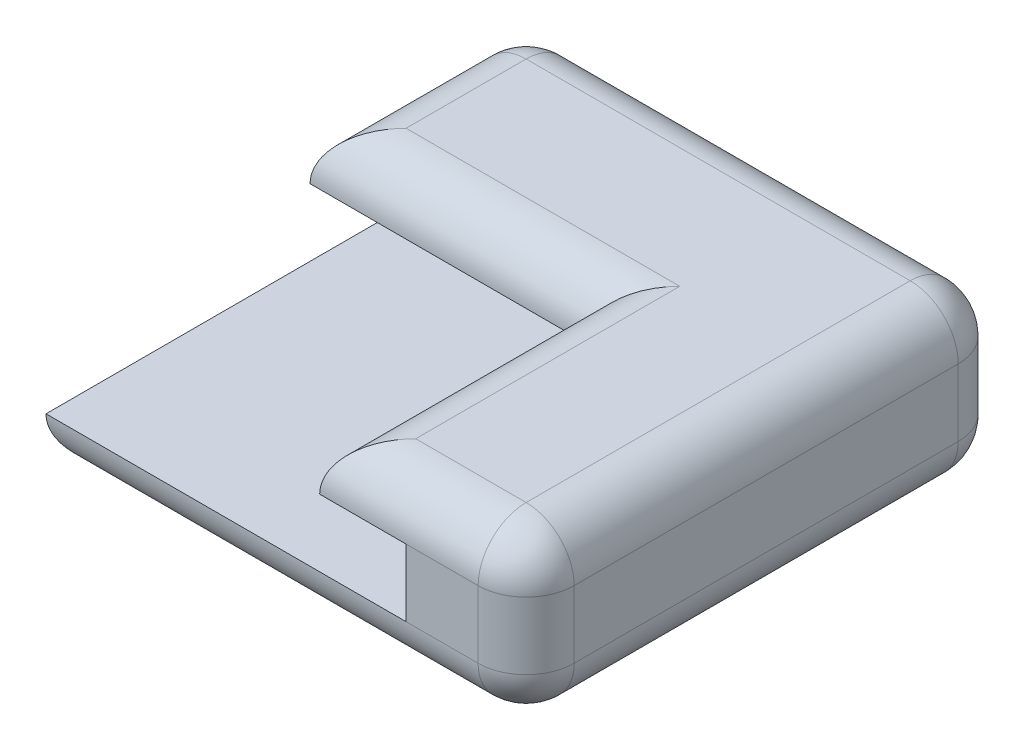
ISO-10303-21;
HEADER;
FILE_DESCRIPTION(('STEP AP214'),'2;1');
FILE_NAME('part.step','',(''),(''),'','','');
FILE_SCHEMA(('AUTOMOTIVE_DESIGN { 1 0 10303 214 1 1 1 1 }'));
ENDSEC;
DATA;
#1=APPLICATION_CONTEXT('core data for automotive mechanical design processes');
#2=APPLICATION_PROTOCOL_DEFINITION('international standard','automotive_design',2000,#1);
#3=PRODUCT_CONTEXT('',#1,'mechanical');
#4=PRODUCT('Part','Part','',(#3));
#5=PRODUCT_RELATED_PRODUCT_CATEGORY('part','',(#4));
#6=PRODUCT_DEFINITION_FORMATION('','',#4);
#7=PRODUCT_DEFINITION_CONTEXT('part definition',#1,'design');
#8=PRODUCT_DEFINITION('design','',#6,#7);
#9=PRODUCT_DEFINITION_SHAPE('','',#8);
#10=(LENGTH_UNIT() NAMED_UNIT(*) SI_UNIT(.MILLI.,.METRE.));
#11=(NAMED_UNIT(*) PLANE_ANGLE_UNIT() SI_UNIT($,.RADIAN.));
#12=(NAMED_UNIT(*) SI_UNIT($,.STERADIAN.) SOLID_ANGLE_UNIT());
#13=UNCERTAINTY_MEASURE_WITH_UNIT(LENGTH_MEASURE(1.E-05),#10,'distance_accuracy_value','');
#14=(GEOMETRIC_REPRESENTATION_CONTEXT(3) GLOBAL_UNCERTAINTY_ASSIGNED_CONTEXT((#13)) GLOBAL_UNIT_ASSIGNED_CONTEXT((#10,
#11,#12)) REPRESENTATION_CONTEXT('',''));
#15=CARTESIAN_POINT('',(0.,0.,0.));
#16=DIRECTION('',(0.,0.,1.));
#17=DIRECTION('',(1.,0.,0.));
#18=AXIS2_PLACEMENT_3D('',#15,#16,#17);
#19=CARTESIAN_POINT('',(12.4996909688744,17.,0.));
#20=DIRECTION('',(-1.,0.,0.));
#21=DIRECTION('',(0.,0.,1.));
#22=AXIS2_PLACEMENT_3D('',#19,#20,#21);
#23=PLANE('',#22);
#24=DIRECTION('',(0.,-1.,0.));
#25=VECTOR('',#24,1.);
#26=CARTESIAN_POINT('',(12.4996909688744,17.,25.));
#27=LINE('',#26,#25);
#28=CARTESIAN_POINT('',(12.4996909688744,12.,25.));
#29=VERTEX_POINT('',#28);
#30=CARTESIAN_POINT('',(12.4996909688744,5.,25.));
#31=VERTEX_POINT('',#30);
#32=EDGE_CURVE('E290',#29,#31,#27,.T.);
#33=ORIENTED_EDGE('',*,*,#32,.F.);
#34=DIRECTION('',(0.,0.,-1.));
#35=VECTOR('',#34,1.);
#36=CARTESIAN_POINT('',(12.4996909688744,12.,-2.4996909688744));
#37=LINE('',#36,#35);
#38=CARTESIAN_POINT('',(12.4996909688744,12.,-12.4996909688744));
#39=VERTEX_POINT('',#38);
#40=EDGE_CURVE('E173',#29,#39,#37,.T.);
#41=ORIENTED_EDGE('',*,*,#40,.T.);
#42=DIRECTION('',(0.,-1.,0.));
#43=VECTOR('',#42,1.);
#44=CARTESIAN_POINT('',(12.4996909688744,17.,-12.4996909688744));
#45=LINE('',#44,#43);
#46=CARTESIAN_POINT('',(12.4996909688744,5.,-12.4996909688744));
#47=VERTEX_POINT('',#46);
#48=EDGE_CURVE('E288',#39,#47,#45,.T.);
#49=ORIENTED_EDGE('',*,*,#48,.T.);
#50=DIRECTION('',(0.,0.,-1.));
#51=VECTOR('',#50,1.);
#52=CARTESIAN_POINT('',(12.4996909688744,5.,0.));
#53=LINE('',#52,#51);
#54=EDGE_CURVE('E296',#31,#47,#53,.T.);
#55=ORIENTED_EDGE('',*,*,#54,.F.);
#56=EDGE_LOOP('',(#33,#41,#49,#55));
#57=FACE_BOUND('',#56,.T.);
#58=ADVANCED_FACE('F43',(#57),#23,.T.);
#59=CARTESIAN_POINT('',(0.,17.,-12.4996909688744));
#60=DIRECTION('',(0.,0.,-1.));
#61=DIRECTION('',(-1.,0.,0.));
#62=AXIS2_PLACEMENT_3D('',#59,#60,#61);
#63=PLANE('',#62);
#64=DIRECTION('',(1.,0.,0.));
#65=VECTOR('',#64,1.);
#66=CARTESIAN_POINT('',(-25.,12.,-12.4996909688744));
#67=LINE('',#66,#65);
#68=CARTESIAN_POINT('',(-25.,12.,-12.4996909688744));
#69=VERTEX_POINT('',#68);
#70=EDGE_CURVE('E174',#69,#39,#67,.T.);
#71=ORIENTED_EDGE('',*,*,#70,.F.);
#72=DIRECTION('',(0.,-1.,0.));
#73=VECTOR('',#72,1.);
#74=CARTESIAN_POINT('',(-25.,17.,-12.4996909688744));
#75=LINE('',#74,#73);
#76=CARTESIAN_POINT('',(-25.,5.,-12.4996909688744));
#77=VERTEX_POINT('',#76);
#78=EDGE_CURVE('E293',#69,#77,#75,.T.);
#79=ORIENTED_EDGE('',*,*,#78,.T.);
#80=DIRECTION('',(1.,0.,0.));
#81=VECTOR('',#80,1.);
#82=CARTESIAN_POINT('',(0.,5.,-12.4996909688744));
#83=LINE('',#82,#81);
#84=EDGE_CURVE('E299',#77,#47,#83,.T.);
#85=ORIENTED_EDGE('',*,*,#84,.T.);
#86=ORIENTED_EDGE('',*,*,#48,.F.);
#87=EDGE_LOOP('',(#71,#79,#85,#86));
#88=FACE_BOUND('',#87,.T.);
#89=ADVANCED_FACE('F370',(#88),#63,.F.);
#90=CARTESIAN_POINT('',(0.,5.,0.));
#91=DIRECTION('',(0.,-1.,0.));
#92=DIRECTION('',(0.,0.,-1.));
#93=AXIS2_PLACEMENT_3D('',#90,#91,#92);
#94=PLANE('',#93);
#95=CARTESIAN_POINT('',(0.,5.,0.));
#96=DIRECTION('',(0.,-1.,0.));
#97=DIRECTION('',(0.,0.,-1.));
#98=AXIS2_PLACEMENT_3D('',#95,#96,#97);
#99=CIRCLE('',#98,1.397);
#100=CARTESIAN_POINT('',(0.,5.,-1.397));
#101=VERTEX_POINT('',#100);
#102=EDGE_CURVE('E47',#101,#101,#99,.T.);
#103=ORIENTED_EDGE('',*,*,#102,.T.);
#104=EDGE_LOOP('',(#103));
#105=FACE_BOUND('',#104,.T.);
#106=ORIENTED_EDGE('',*,*,#84,.F.);
#107=DIRECTION('',(0.,0.,1.));
#108=VECTOR('',#107,1.);
#109=CARTESIAN_POINT('',(-25.,5.,25.));
#110=LINE('',#109,#108);
#111=CARTESIAN_POINT('',(-25.,5.,25.));
#112=VERTEX_POINT('',#111);
#113=EDGE_CURVE('E286',#77,#112,#110,.T.);
#114=ORIENTED_EDGE('',*,*,#113,.T.);
#115=DIRECTION('',(1.,0.,0.));
#116=VECTOR('',#115,1.);
#117=CARTESIAN_POINT('',(-25.,5.,25.));
#118=LINE('',#117,#116);
#119=EDGE_CURVE('E283',#112,#31,#118,.T.);
#120=ORIENTED_EDGE('',*,*,#119,.T.);
#121=ORIENTED_EDGE('',*,*,#54,.T.);
#122=EDGE_LOOP('',(#106,#114,#120,#121));
#123=FACE_BOUND('',#122,.T.);
#124=ADVANCED_FACE('F382',(#105,#123),#94,.F.);
#125=CARTESIAN_POINT('',(25.,5.,25.));
#126=DIRECTION('',(-1.,0.,0.));
#127=DIRECTION('',(0.,0.,1.));
#128=AXIS2_PLACEMENT_3D('',#125,#126,#127);
#129=PLANE('',#128);
#130=DIRECTION('',(0.,0.,-1.));
#131=VECTOR('',#130,1.);
#132=CARTESIAN_POINT('',(25.,5.,-25.));
#133=LINE('',#132,#131);
#134=CARTESIAN_POINT('',(25.,5.,20.));
#135=VERTEX_POINT('',#134);
#136=CARTESIAN_POINT('',(25.,5.,-20.));
#137=VERTEX_POINT('',#136);
#138=EDGE_CURVE('E251',#135,#137,#133,.T.);
#139=ORIENTED_EDGE('',*,*,#138,.T.);
#140=DIRECTION('',(0.,-1.,0.));
#141=VECTOR('',#140,1.);
#142=CARTESIAN_POINT('',(25.,5.,-20.));
#143=LINE('',#142,#141);
#144=CARTESIAN_POINT('',(25.,12.,-20.));
#145=VERTEX_POINT('',#144);
#146=EDGE_CURVE('E244',#137,#145,#143,.F.);
#147=ORIENTED_EDGE('',*,*,#146,.T.);
#148=DIRECTION('',(0.,0.,-1.));
#149=VECTOR('',#148,1.);
#150=CARTESIAN_POINT('',(25.,12.,25.));
#151=LINE('',#150,#149);
#152=CARTESIAN_POINT('',(25.,12.,20.));
#153=VERTEX_POINT('',#152);
#154=EDGE_CURVE('E247',#145,#153,#151,.F.);
#155=ORIENTED_EDGE('',*,*,#154,.T.);
#156=DIRECTION('',(0.,-1.,0.));
#157=VECTOR('',#156,1.);
#158=CARTESIAN_POINT('',(25.,5.,20.));
#159=LINE('',#158,#157);
#160=EDGE_CURVE('E249',#153,#135,#159,.T.);
#161=ORIENTED_EDGE('',*,*,#160,.T.);
#162=EDGE_LOOP('',(#139,#147,#155,#161));
#163=FACE_BOUND('',#162,.T.);
#164=ADVANCED_FACE('F396',(#163),#129,.F.);
#165=CARTESIAN_POINT('',(-25.,5.,-25.));
#166=DIRECTION('',(0.,0.,1.));
#167=DIRECTION('',(1.,0.,0.));
#168=AXIS2_PLACEMENT_3D('',#165,#166,#167);
#169=PLANE('',#168);
#170=DIRECTION('',(0.,-1.,0.));
#171=VECTOR('',#170,1.);
#172=CARTESIAN_POINT('',(20.,5.,-25.));
#173=LINE('',#172,#171);
#174=CARTESIAN_POINT('',(20.,12.,-25.));
#175=VERTEX_POINT('',#174);
#176=CARTESIAN_POINT('',(20.,5.,-25.));
#177=VERTEX_POINT('',#176);
#178=EDGE_CURVE('E256',#175,#177,#173,.T.);
#179=ORIENTED_EDGE('',*,*,#178,.T.);
#180=DIRECTION('',(-1.,0.,0.));
#181=VECTOR('',#180,1.);
#182=CARTESIAN_POINT('',(-25.,5.,-25.));
#183=LINE('',#182,#181);
#184=CARTESIAN_POINT('',(-20.,5.,-25.));
#185=VERTEX_POINT('',#184);
#186=EDGE_CURVE('E253',#177,#185,#183,.T.);
#187=ORIENTED_EDGE('',*,*,#186,.T.);
#188=DIRECTION('',(0.,-1.,0.));
#189=VECTOR('',#188,1.);
#190=CARTESIAN_POINT('',(-20.,5.,-25.));
#191=LINE('',#190,#189);
#192=CARTESIAN_POINT('',(-20.,12.,-25.));
#193=VERTEX_POINT('',#192);
#194=EDGE_CURVE('E258',#185,#193,#191,.F.);
#195=ORIENTED_EDGE('',*,*,#194,.T.);
#196=DIRECTION('',(-1.,0.,0.));
#197=VECTOR('',#196,1.);
#198=CARTESIAN_POINT('',(25.,12.,-25.));
#199=LINE('',#198,#197);
#200=EDGE_CURVE('E260',#193,#175,#199,.F.);
#201=ORIENTED_EDGE('',*,*,#200,.T.);
#202=EDGE_LOOP('',(#179,#187,#195,#201));
#203=FACE_BOUND('',#202,.T.);
#204=ADVANCED_FACE('F403',(#203),#169,.F.);
#205=CARTESIAN_POINT('',(-25.,5.,25.));
#206=DIRECTION('',(1.,0.,0.));
#207=DIRECTION('',(0.,0.,-1.));
#208=AXIS2_PLACEMENT_3D('',#205,#206,#207);
#209=PLANE('',#208);
#210=DIRECTION('',(0.,-1.,0.));
#211=VECTOR('',#210,1.);
#212=CARTESIAN_POINT('',(-25.,5.,-20.));
#213=LINE('',#212,#211);
#214=CARTESIAN_POINT('',(-25.,12.,-20.));
#215=VERTEX_POINT('',#214);
#216=CARTESIAN_POINT('',(-25.,5.,-20.));
#217=VERTEX_POINT('',#216);
#218=EDGE_CURVE('E264',#215,#217,#213,.T.);
#219=ORIENTED_EDGE('',*,*,#218,.T.);
#220=DIRECTION('',(0.,0.,1.));
#221=VECTOR('',#220,1.);
#222=CARTESIAN_POINT('',(-25.,5.,25.));
#223=LINE('',#222,#221);
#224=EDGE_CURVE('E262',#217,#77,#223,.T.);
#225=ORIENTED_EDGE('',*,*,#224,.T.);
#226=ORIENTED_EDGE('',*,*,#78,.F.);
#227=DIRECTION('',(0.,0.,1.));
#228=VECTOR('',#227,1.);
#229=CARTESIAN_POINT('',(-25.,12.,-25.));
#230=LINE('',#229,#228);
#231=EDGE_CURVE('E266',#69,#215,#230,.F.);
#232=ORIENTED_EDGE('',*,*,#231,.T.);
#233=EDGE_LOOP('',(#219,#225,#226,#232));
#234=FACE_BOUND('',#233,.T.);
#235=ADVANCED_FACE('F373',(#234),#209,.F.);
#236=CARTESIAN_POINT('',(-25.,5.,25.));
#237=DIRECTION('',(0.,0.,-1.));
#238=DIRECTION('',(-1.,0.,0.));
#239=AXIS2_PLACEMENT_3D('',#236,#237,#238);
#240=PLANE('',#239);
#241=ORIENTED_EDGE('',*,*,#32,.T.);
#242=DIRECTION('',(1.,0.,0.));
#243=VECTOR('',#242,1.);
#244=CARTESIAN_POINT('',(25.,5.,25.));
#245=LINE('',#244,#243);
#246=CARTESIAN_POINT('',(20.,5.,25.));
#247=VERTEX_POINT('',#246);
#248=EDGE_CURVE('E277',#31,#247,#245,.T.);
#249=ORIENTED_EDGE('',*,*,#248,.T.);
#250=DIRECTION('',(0.,-1.,0.));
#251=VECTOR('',#250,1.);
#252=CARTESIAN_POINT('',(20.,5.,25.));
#253=LINE('',#252,#251);
#254=CARTESIAN_POINT('',(20.,12.,25.));
#255=VERTEX_POINT('',#254);
#256=EDGE_CURVE('E281',#247,#255,#253,.F.);
#257=ORIENTED_EDGE('',*,*,#256,.T.);
#258=DIRECTION('',(1.,0.,0.));
#259=VECTOR('',#258,1.);
#260=CARTESIAN_POINT('',(3.49969096887439,12.,25.));
#261=LINE('',#260,#259);
#262=EDGE_CURVE('E279',#255,#29,#261,.F.);
#263=ORIENTED_EDGE('',*,*,#262,.T.);
#264=EDGE_LOOP('',(#241,#249,#257,#263));
#265=FACE_BOUND('',#264,.T.);
#266=ADVANCED_FACE('F324',(#265),#240,.F.);
#267=CARTESIAN_POINT('',(0.,0.,0.));
#268=DIRECTION('',(0.,-1.,0.));
#269=DIRECTION('',(0.,0.,-1.));
#270=AXIS2_PLACEMENT_3D('',#267,#268,#269);
#271=PLANE('',#270);
#272=CARTESIAN_POINT('',(0.,0.,0.));
#273=DIRECTION('',(0.,-1.,0.));
#274=DIRECTION('',(0.,0.,-1.));
#275=AXIS2_PLACEMENT_3D('',#272,#273,#274);
#276=CIRCLE('',#275,2.97688);
#277=CARTESIAN_POINT('',(0.,0.,-2.97688));
#278=VERTEX_POINT('',#277);
#279=EDGE_CURVE('E314',#278,#278,#276,.T.);
#280=ORIENTED_EDGE('',*,*,#279,.F.);
#281=EDGE_LOOP('',(#280));
#282=FACE_BOUND('',#281,.T.);
#283=DIRECTION('',(0.,0.,-1.));
#284=VECTOR('',#283,1.);
#285=CARTESIAN_POINT('',(20.,0.,25.));
#286=LINE('',#285,#284);
#287=CARTESIAN_POINT('',(20.,0.,-20.));
#288=VERTEX_POINT('',#287);
#289=CARTESIAN_POINT('',(20.,0.,20.));
#290=VERTEX_POINT('',#289);
#291=EDGE_CURVE('E275',#288,#290,#286,.F.);
#292=ORIENTED_EDGE('',*,*,#291,.T.);
#293=DIRECTION('',(1.,0.,0.));
#294=VECTOR('',#293,1.);
#295=CARTESIAN_POINT('',(-25.,0.,20.));
#296=LINE('',#295,#294);
#297=CARTESIAN_POINT('',(-20.,0.,20.));
#298=VERTEX_POINT('',#297);
#299=EDGE_CURVE('E268',#290,#298,#296,.F.);
#300=ORIENTED_EDGE('',*,*,#299,.T.);
#301=DIRECTION('',(0.,0.,1.));
#302=VECTOR('',#301,1.);
#303=CARTESIAN_POINT('',(-20.,0.,-25.));
#304=LINE('',#303,#302);
#305=CARTESIAN_POINT('',(-20.,0.,-20.));
#306=VERTEX_POINT('',#305);
#307=EDGE_CURVE('E271',#298,#306,#304,.F.);
#308=ORIENTED_EDGE('',*,*,#307,.T.);
#309=DIRECTION('',(-1.,0.,0.));
#310=VECTOR('',#309,1.);
#311=CARTESIAN_POINT('',(25.,0.,-20.));
#312=LINE('',#311,#310);
#313=EDGE_CURVE('E273',#306,#288,#312,.F.);
#314=ORIENTED_EDGE('',*,*,#313,.T.);
#315=EDGE_LOOP('',(#292,#300,#308,#314));
#316=FACE_BOUND('',#315,.T.);
#317=ADVANCED_FACE('F320',(#282,#316),#271,.T.);
#318=CARTESIAN_POINT('',(0.,17.,0.));
#319=DIRECTION('',(0.,1.,0.));
#320=DIRECTION('',(0.,0.,1.));
#321=AXIS2_PLACEMENT_3D('',#318,#319,#320);
#322=PLANE('',#321);
#323=DIRECTION('',(0.,0.,-1.));
#324=VECTOR('',#323,1.);
#325=CARTESIAN_POINT('',(20.,17.,-25.));
#326=LINE('',#325,#324);
#327=CARTESIAN_POINT('',(20.,17.,20.));
#328=VERTEX_POINT('',#327);
#329=CARTESIAN_POINT('',(20.,17.,-20.));
#330=VERTEX_POINT('',#329);
#331=EDGE_CURVE('E239',#328,#330,#326,.T.);
#332=ORIENTED_EDGE('',*,*,#331,.T.);
#333=DIRECTION('',(-1.,0.,0.));
#334=VECTOR('',#333,1.);
#335=CARTESIAN_POINT('',(-25.,17.,-20.));
#336=LINE('',#335,#334);
#337=CARTESIAN_POINT('',(-20.,17.,-20.));
#338=VERTEX_POINT('',#337);
#339=EDGE_CURVE('E11',#330,#338,#336,.T.);
#340=ORIENTED_EDGE('',*,*,#339,.T.);
#341=DIRECTION('',(0.,0.,1.));
#342=VECTOR('',#341,1.);
#343=CARTESIAN_POINT('',(-20.,17.,-2.4996909688744));
#344=LINE('',#343,#342);
#345=CARTESIAN_POINT('',(-20.,17.,-7.4996909688744));
#346=VERTEX_POINT('',#345);
#347=EDGE_CURVE('E52',#338,#346,#344,.T.);
#348=ORIENTED_EDGE('',*,*,#347,.T.);
#349=DIRECTION('',(-1.,0.,0.));
#350=VECTOR('',#349,1.);
#351=CARTESIAN_POINT('',(0.,17.,-7.4996909688744));
#352=LINE('',#351,#350);
#353=CARTESIAN_POINT('',(8.4996909688744,17.,-7.4996909688744));
#354=VERTEX_POINT('',#353);
#355=EDGE_CURVE('E237',#346,#354,#352,.F.);
#356=ORIENTED_EDGE('',*,*,#355,.T.);
#357=DIRECTION('',(0.,0.,-1.));
#358=VECTOR('',#357,1.);
#359=CARTESIAN_POINT('',(8.4996909688744,17.,25.));
#360=LINE('',#359,#358);
#361=CARTESIAN_POINT('',(8.4996909688744,17.,20.));
#362=VERTEX_POINT('',#361);
#363=EDGE_CURVE('E177',#354,#362,#360,.F.);
#364=ORIENTED_EDGE('',*,*,#363,.T.);
#365=DIRECTION('',(1.,0.,0.));
#366=VECTOR('',#365,1.);
#367=CARTESIAN_POINT('',(25.,17.,20.));
#368=LINE('',#367,#366);
#369=EDGE_CURVE('E242',#362,#328,#368,.T.);
#370=ORIENTED_EDGE('',*,*,#369,.T.);
#371=EDGE_LOOP('',(#332,#340,#348,#356,#364,#370));
#372=FACE_BOUND('',#371,.T.);
#373=ADVANCED_FACE('F323',(#372),#322,.T.);
#374=CARTESIAN_POINT('',(-25.,12.,-2.4996909688744));
#375=DIRECTION('',(0.,1.,0.));
#376=DIRECTION('',(0.,0.,1.));
#377=AXIS2_PLACEMENT_3D('',#374,#375,#376);
#378=PLANE('',#377);
#379=ORIENTED_EDGE('',*,*,#70,.T.);
#380=ORIENTED_EDGE('',*,*,#40,.F.);
#381=DIRECTION('',(1.,0.,0.));
#382=VECTOR('',#381,1.);
#383=CARTESIAN_POINT('',(3.49969096887439,12.,25.));
#384=LINE('',#383,#382);
#385=CARTESIAN_POINT('',(3.49969096887439,12.,25.));
#386=VERTEX_POINT('',#385);
#387=EDGE_CURVE('E160',#386,#29,#384,.T.);
#388=ORIENTED_EDGE('',*,*,#387,.F.);
#389=DIRECTION('',(0.,0.,1.));
#390=VECTOR('',#389,1.);
#391=CARTESIAN_POINT('',(3.49969096887439,12.,25.));
#392=LINE('',#391,#390);
#393=CARTESIAN_POINT('',(3.49969096887439,12.,-2.4996909688744));
#394=VERTEX_POINT('',#393);
#395=EDGE_CURVE('E153',#394,#386,#392,.T.);
#396=ORIENTED_EDGE('',*,*,#395,.F.);
#397=DIRECTION('',(1.,0.,0.));
#398=VECTOR('',#397,1.);
#399=CARTESIAN_POINT('',(-25.,12.,-2.4996909688744));
#400=LINE('',#399,#398);
#401=CARTESIAN_POINT('',(-25.,12.,-2.4996909688744));
#402=VERTEX_POINT('',#401);
#403=EDGE_CURVE('E156',#402,#394,#400,.T.);
#404=ORIENTED_EDGE('',*,*,#403,.F.);
#405=DIRECTION('',(0.,0.,-1.));
#406=VECTOR('',#405,1.);
#407=CARTESIAN_POINT('',(-25.,12.,-2.4996909688744));
#408=LINE('',#407,#406);
#409=EDGE_CURVE('E302',#402,#69,#408,.T.);
#410=ORIENTED_EDGE('',*,*,#409,.T.);
#411=EDGE_LOOP('',(#379,#380,#388,#396,#404,#410));
#412=FACE_BOUND('',#411,.T.);
#413=ADVANCED_FACE('F155',(#412),#378,.F.);
#414=CARTESIAN_POINT('',(0.,12.,-7.4996909688744));
#415=DIRECTION('',(-1.,0.,0.));
#416=DIRECTION('',(0.,0.,1.));
#417=AXIS2_PLACEMENT_3D('',#414,#415,#416);
#418=CYLINDRICAL_SURFACE('',#417,5.);
#419=CARTESIAN_POINT('',(8.4996909688744,12.,-7.4996909688744));
#420=DIRECTION('',(0.707106781186547,0.,0.707106781186547));
#421=DIRECTION('',(-0.707106781186547,0.,0.707106781186547));
#422=AXIS2_PLACEMENT_3D('',#419,#420,#421);
#423=ELLIPSE('',#422,7.07106781186547,5.);
#424=EDGE_CURVE('E169',#354,#394,#423,.T.);
#425=ORIENTED_EDGE('',*,*,#424,.F.);
#426=ORIENTED_EDGE('',*,*,#355,.F.);
#427=CARTESIAN_POINT('',(-20.,12.,-7.4996909688744));
#428=DIRECTION('',(-0.707106781186547,0.,-0.707106781186547));
#429=DIRECTION('',(-0.707106781186547,0.,0.707106781186547));
#430=AXIS2_PLACEMENT_3D('',#427,#428,#429);
#431=ELLIPSE('',#430,7.07106781186547,5.);
#432=EDGE_CURVE('E165',#402,#346,#431,.T.);
#433=ORIENTED_EDGE('',*,*,#432,.F.);
#434=ORIENTED_EDGE('',*,*,#403,.T.);
#435=EDGE_LOOP('',(#425,#426,#433,#434));
#436=FACE_BOUND('',#435,.T.);
#437=ADVANCED_FACE('F45',(#436),#418,.T.);
#438=CARTESIAN_POINT('',(0.,12.,-20.));
#439=DIRECTION('',(1.,0.,0.));
#440=DIRECTION('',(0.,0.,-1.));
#441=AXIS2_PLACEMENT_3D('',#438,#439,#440);
#442=CYLINDRICAL_SURFACE('',#441,5.);
#443=CARTESIAN_POINT('',(-20.,12.,-20.));
#444=DIRECTION('',(-1.,0.,0.));
#445=DIRECTION('',(0.,0.,1.));
#446=AXIS2_PLACEMENT_3D('',#443,#444,#445);
#447=CIRCLE('',#446,5.);
#448=EDGE_CURVE('E181',#338,#193,#447,.T.);
#449=ORIENTED_EDGE('',*,*,#448,.F.);
#450=ORIENTED_EDGE('',*,*,#339,.F.);
#451=CARTESIAN_POINT('',(20.,12.,-20.));
#452=DIRECTION('',(1.,0.,0.));
#453=DIRECTION('',(0.,1.,0.));
#454=AXIS2_PLACEMENT_3D('',#451,#452,#453);
#455=CIRCLE('',#454,5.);
#456=EDGE_CURVE('E178',#175,#330,#455,.T.);
#457=ORIENTED_EDGE('',*,*,#456,.F.);
#458=ORIENTED_EDGE('',*,*,#200,.F.);
#459=EDGE_LOOP('',(#449,#450,#457,#458));
#460=FACE_BOUND('',#459,.T.);
#461=ADVANCED_FACE('F458',(#460),#442,.T.);
#462=CARTESIAN_POINT('',(-20.,12.,0.));
#463=DIRECTION('',(0.,0.,-1.));
#464=DIRECTION('',(-1.,0.,0.));
#465=AXIS2_PLACEMENT_3D('',#462,#463,#464);
#466=CYLINDRICAL_SURFACE('',#465,5.);
#467=ORIENTED_EDGE('',*,*,#432,.T.);
#468=ORIENTED_EDGE('',*,*,#347,.F.);
#469=CARTESIAN_POINT('',(-20.,12.,-20.));
#470=DIRECTION('',(0.,0.,-1.));
#471=DIRECTION('',(0.,1.,0.));
#472=AXIS2_PLACEMENT_3D('',#469,#470,#471);
#473=CIRCLE('',#472,5.);
#474=EDGE_CURVE('E186',#215,#338,#473,.T.);
#475=ORIENTED_EDGE('',*,*,#474,.F.);
#476=ORIENTED_EDGE('',*,*,#231,.F.);
#477=ORIENTED_EDGE('',*,*,#409,.F.);
#478=EDGE_LOOP('',(#467,#468,#475,#476,#477));
#479=FACE_BOUND('',#478,.T.);
#480=ADVANCED_FACE('F362',(#479),#466,.T.);
#481=CARTESIAN_POINT('',(8.4996909688744,12.,0.));
#482=DIRECTION('',(0.,0.,1.));
#483=DIRECTION('',(1.,0.,0.));
#484=AXIS2_PLACEMENT_3D('',#481,#482,#483);
#485=CYLINDRICAL_SURFACE('',#484,5.);
#486=ORIENTED_EDGE('',*,*,#424,.T.);
#487=ORIENTED_EDGE('',*,*,#395,.T.);
#488=CARTESIAN_POINT('',(8.4996909688744,12.,20.));
#489=DIRECTION('',(-0.707106781186547,0.,-0.707106781186547));
#490=DIRECTION('',(-0.707106781186547,0.,0.707106781186547));
#491=AXIS2_PLACEMENT_3D('',#488,#489,#490);
#492=ELLIPSE('',#491,7.07106781186547,5.);
#493=EDGE_CURVE('E189',#362,#386,#492,.F.);
#494=ORIENTED_EDGE('',*,*,#493,.F.);
#495=ORIENTED_EDGE('',*,*,#363,.F.);
#496=EDGE_LOOP('',(#486,#487,#494,#495));
#497=FACE_BOUND('',#496,.T.);
#498=ADVANCED_FACE('F176',(#497),#485,.T.);
#499=CARTESIAN_POINT('',(20.,12.,-20.));
#500=DIRECTION('',(0.,1.,0.));
#501=DIRECTION('',(0.,0.,1.));
#502=AXIS2_PLACEMENT_3D('',#499,#500,#501);
#503=SPHERICAL_SURFACE('',#502,5.);
#504=CARTESIAN_POINT('',(20.,12.,-20.));
#505=DIRECTION('',(0.,1.,0.));
#506=DIRECTION('',(0.,0.,1.));
#507=AXIS2_PLACEMENT_3D('',#504,#505,#506);
#508=CIRCLE('',#507,5.);
#509=EDGE_CURVE('E193',#175,#145,#508,.F.);
#510=ORIENTED_EDGE('',*,*,#509,.F.);
#511=ORIENTED_EDGE('',*,*,#456,.T.);
#512=CARTESIAN_POINT('',(20.,12.,-20.));
#513=DIRECTION('',(0.,0.,-1.));
#514=DIRECTION('',(-1.,0.,0.));
#515=AXIS2_PLACEMENT_3D('',#512,#513,#514);
#516=CIRCLE('',#515,5.);
#517=EDGE_CURVE('E191',#145,#330,#516,.F.);
#518=ORIENTED_EDGE('',*,*,#517,.F.);
#519=EDGE_LOOP('',(#510,#511,#518));
#520=FACE_BOUND('',#519,.T.);
#521=ADVANCED_FACE('F450',(#520),#503,.T.);
#522=CARTESIAN_POINT('',(-20.,12.,-20.));
#523=DIRECTION('',(0.,1.,0.));
#524=DIRECTION('',(0.,0.,1.));
#525=AXIS2_PLACEMENT_3D('',#522,#523,#524);
#526=SPHERICAL_SURFACE('',#525,5.);
#527=ORIENTED_EDGE('',*,*,#474,.T.);
#528=ORIENTED_EDGE('',*,*,#448,.T.);
#529=CARTESIAN_POINT('',(-20.,12.,-20.));
#530=DIRECTION('',(0.,1.,0.));
#531=DIRECTION('',(0.,0.,1.));
#532=AXIS2_PLACEMENT_3D('',#529,#530,#531);
#533=CIRCLE('',#532,5.);
#534=EDGE_CURVE('E196',#215,#193,#533,.F.);
#535=ORIENTED_EDGE('',*,*,#534,.F.);
#536=EDGE_LOOP('',(#527,#528,#535));
#537=FACE_BOUND('',#536,.T.);
#538=ADVANCED_FACE('F447',(#537),#526,.T.);
#539=CARTESIAN_POINT('',(0.,12.,20.));
#540=DIRECTION('',(-1.,0.,0.));
#541=DIRECTION('',(0.,0.,1.));
#542=AXIS2_PLACEMENT_3D('',#539,#540,#541);
#543=CYLINDRICAL_SURFACE('',#542,5.);
#544=ORIENTED_EDGE('',*,*,#387,.T.);
#545=ORIENTED_EDGE('',*,*,#262,.F.);
#546=CARTESIAN_POINT('',(20.,12.,20.));
#547=DIRECTION('',(1.,0.,0.));
#548=DIRECTION('',(0.,0.,-1.));
#549=AXIS2_PLACEMENT_3D('',#546,#547,#548);
#550=CIRCLE('',#549,5.);
#551=EDGE_CURVE('E199',#328,#255,#550,.T.);
#552=ORIENTED_EDGE('',*,*,#551,.F.);
#553=ORIENTED_EDGE('',*,*,#369,.F.);
#554=ORIENTED_EDGE('',*,*,#493,.T.);
#555=EDGE_LOOP('',(#544,#545,#552,#553,#554));
#556=FACE_BOUND('',#555,.T.);
#557=ADVANCED_FACE('F352',(#556),#543,.T.);
#558=CARTESIAN_POINT('',(20.,12.,0.));
#559=DIRECTION('',(0.,0.,1.));
#560=DIRECTION('',(1.,0.,0.));
#561=AXIS2_PLACEMENT_3D('',#558,#559,#560);
#562=CYLINDRICAL_SURFACE('',#561,5.);
#563=ORIENTED_EDGE('',*,*,#517,.T.);
#564=ORIENTED_EDGE('',*,*,#331,.F.);
#565=CARTESIAN_POINT('',(20.,12.,20.));
#566=DIRECTION('',(0.,0.,1.));
#567=DIRECTION('',(1.,0.,0.));
#568=AXIS2_PLACEMENT_3D('',#565,#566,#567);
#569=CIRCLE('',#568,5.);
#570=EDGE_CURVE('E202',#153,#328,#569,.T.);
#571=ORIENTED_EDGE('',*,*,#570,.F.);
#572=ORIENTED_EDGE('',*,*,#154,.F.);
#573=EDGE_LOOP('',(#563,#564,#571,#572));
#574=FACE_BOUND('',#573,.T.);
#575=ADVANCED_FACE('F359',(#574),#562,.T.);
#576=CARTESIAN_POINT('',(20.,5.,-20.));
#577=DIRECTION('',(0.,-1.,0.));
#578=DIRECTION('',(0.,0.,-1.));
#579=AXIS2_PLACEMENT_3D('',#576,#577,#578);
#580=CYLINDRICAL_SURFACE('',#579,5.);
#581=ORIENTED_EDGE('',*,*,#509,.T.);
#582=ORIENTED_EDGE('',*,*,#146,.F.);
#583=CARTESIAN_POINT('',(20.,5.,-20.));
#584=DIRECTION('',(0.,-1.,0.));
#585=DIRECTION('',(0.,0.,-1.));
#586=AXIS2_PLACEMENT_3D('',#583,#584,#585);
#587=CIRCLE('',#586,5.);
#588=EDGE_CURVE('E205',#177,#137,#587,.T.);
#589=ORIENTED_EDGE('',*,*,#588,.F.);
#590=ORIENTED_EDGE('',*,*,#178,.F.);
#591=EDGE_LOOP('',(#581,#582,#589,#590));
#592=FACE_BOUND('',#591,.T.);
#593=ADVANCED_FACE('F438',(#592),#580,.T.);
#594=CARTESIAN_POINT('',(-25.,5.,-20.));
#595=DIRECTION('',(1.,0.,0.));
#596=DIRECTION('',(0.,0.,-1.));
#597=AXIS2_PLACEMENT_3D('',#594,#595,#596);
#598=CYLINDRICAL_SURFACE('',#597,5.);
#599=CARTESIAN_POINT('',(-20.,5.,-20.));
#600=DIRECTION('',(-1.,0.,0.));
#601=DIRECTION('',(0.,0.,1.));
#602=AXIS2_PLACEMENT_3D('',#599,#600,#601);
#603=CIRCLE('',#602,5.);
#604=EDGE_CURVE('E211',#185,#306,#603,.T.);
#605=ORIENTED_EDGE('',*,*,#604,.F.);
#606=ORIENTED_EDGE('',*,*,#186,.F.);
#607=CARTESIAN_POINT('',(20.,5.,-20.));
#608=DIRECTION('',(1.,0.,0.));
#609=DIRECTION('',(0.,0.,-1.));
#610=AXIS2_PLACEMENT_3D('',#607,#608,#609);
#611=CIRCLE('',#610,5.);
#612=EDGE_CURVE('E208',#288,#177,#611,.T.);
#613=ORIENTED_EDGE('',*,*,#612,.F.);
#614=ORIENTED_EDGE('',*,*,#313,.F.);
#615=EDGE_LOOP('',(#605,#606,#613,#614));
#616=FACE_BOUND('',#615,.T.);
#617=ADVANCED_FACE('F434',(#616),#598,.T.);
#618=CARTESIAN_POINT('',(-20.,5.,-20.));
#619=DIRECTION('',(0.,-1.,0.));
#620=DIRECTION('',(0.,0.,-1.));
#621=AXIS2_PLACEMENT_3D('',#618,#619,#620);
#622=CYLINDRICAL_SURFACE('',#621,5.);
#623=ORIENTED_EDGE('',*,*,#534,.T.);
#624=ORIENTED_EDGE('',*,*,#194,.F.);
#625=CARTESIAN_POINT('',(-20.,5.,-20.));
#626=DIRECTION('',(0.,-1.,0.));
#627=DIRECTION('',(0.,0.,-1.));
#628=AXIS2_PLACEMENT_3D('',#625,#626,#627);
#629=CIRCLE('',#628,5.);
#630=EDGE_CURVE('E214',#217,#185,#629,.T.);
#631=ORIENTED_EDGE('',*,*,#630,.F.);
#632=ORIENTED_EDGE('',*,*,#218,.F.);
#633=EDGE_LOOP('',(#623,#624,#631,#632));
#634=FACE_BOUND('',#633,.T.);
#635=ADVANCED_FACE('F431',(#634),#622,.T.);
#636=CARTESIAN_POINT('',(20.,12.,20.));
#637=DIRECTION('',(0.,1.,0.));
#638=DIRECTION('',(0.,0.,1.));
#639=AXIS2_PLACEMENT_3D('',#636,#637,#638);
#640=SPHERICAL_SURFACE('',#639,5.);
#641=ORIENTED_EDGE('',*,*,#570,.T.);
#642=ORIENTED_EDGE('',*,*,#551,.T.);
#643=CARTESIAN_POINT('',(20.,12.,20.));
#644=DIRECTION('',(0.,1.,0.));
#645=DIRECTION('',(0.,0.,1.));
#646=AXIS2_PLACEMENT_3D('',#643,#644,#645);
#647=CIRCLE('',#646,5.);
#648=EDGE_CURVE('E216',#153,#255,#647,.F.);
#649=ORIENTED_EDGE('',*,*,#648,.F.);
#650=EDGE_LOOP('',(#641,#642,#649));
#651=FACE_BOUND('',#650,.T.);
#652=ADVANCED_FACE('F355',(#651),#640,.T.);
#653=CARTESIAN_POINT('',(20.,5.,-20.));
#654=DIRECTION('',(0.,0.,-1.));
#655=DIRECTION('',(-1.,0.,0.));
#656=AXIS2_PLACEMENT_3D('',#653,#654,#655);
#657=SPHERICAL_SURFACE('',#656,5.);
#658=ORIENTED_EDGE('',*,*,#612,.T.);
#659=ORIENTED_EDGE('',*,*,#588,.T.);
#660=CARTESIAN_POINT('',(20.,5.,-20.));
#661=DIRECTION('',(0.,0.,-1.));
#662=DIRECTION('',(-1.,0.,0.));
#663=AXIS2_PLACEMENT_3D('',#660,#661,#662);
#664=CIRCLE('',#663,5.);
#665=EDGE_CURVE('E219',#288,#137,#664,.F.);
#666=ORIENTED_EDGE('',*,*,#665,.F.);
#667=EDGE_LOOP('',(#658,#659,#666));
#668=FACE_BOUND('',#667,.T.);
#669=ADVANCED_FACE('F424',(#668),#657,.T.);
#670=CARTESIAN_POINT('',(-20.,5.,-20.));
#671=DIRECTION('',(0.,0.,-1.));
#672=DIRECTION('',(-1.,0.,0.));
#673=AXIS2_PLACEMENT_3D('',#670,#671,#672);
#674=SPHERICAL_SURFACE('',#673,5.);
#675=ORIENTED_EDGE('',*,*,#630,.T.);
#676=ORIENTED_EDGE('',*,*,#604,.T.);
#677=CARTESIAN_POINT('',(-20.,5.,-20.));
#678=DIRECTION('',(0.,0.,-1.));
#679=DIRECTION('',(-1.,0.,0.));
#680=AXIS2_PLACEMENT_3D('',#677,#678,#679);
#681=CIRCLE('',#680,5.);
#682=EDGE_CURVE('E222',#217,#306,#681,.F.);
#683=ORIENTED_EDGE('',*,*,#682,.F.);
#684=EDGE_LOOP('',(#675,#676,#683));
#685=FACE_BOUND('',#684,.T.);
#686=ADVANCED_FACE('F421',(#685),#674,.T.);
#687=CARTESIAN_POINT('',(20.,5.,20.));
#688=DIRECTION('',(0.,-1.,0.));
#689=DIRECTION('',(0.,0.,-1.));
#690=AXIS2_PLACEMENT_3D('',#687,#688,#689);
#691=CYLINDRICAL_SURFACE('',#690,5.);
#692=ORIENTED_EDGE('',*,*,#648,.T.);
#693=ORIENTED_EDGE('',*,*,#256,.F.);
#694=CARTESIAN_POINT('',(20.,5.,20.));
#695=DIRECTION('',(0.,-1.,0.));
#696=DIRECTION('',(0.,0.,-1.));
#697=AXIS2_PLACEMENT_3D('',#694,#695,#696);
#698=CIRCLE('',#697,5.);
#699=EDGE_CURVE('E225',#135,#247,#698,.T.);
#700=ORIENTED_EDGE('',*,*,#699,.F.);
#701=ORIENTED_EDGE('',*,*,#160,.F.);
#702=EDGE_LOOP('',(#692,#693,#700,#701));
#703=FACE_BOUND('',#702,.T.);
#704=ADVANCED_FACE('F346',(#703),#691,.T.);
#705=CARTESIAN_POINT('',(20.,5.,25.));
#706=DIRECTION('',(0.,0.,1.));
#707=DIRECTION('',(1.,0.,0.));
#708=AXIS2_PLACEMENT_3D('',#705,#706,#707);
#709=CYLINDRICAL_SURFACE('',#708,5.);
#710=ORIENTED_EDGE('',*,*,#665,.T.);
#711=ORIENTED_EDGE('',*,*,#138,.F.);
#712=CARTESIAN_POINT('',(20.,5.,20.));
#713=DIRECTION('',(0.,0.,1.));
#714=DIRECTION('',(1.,0.,0.));
#715=AXIS2_PLACEMENT_3D('',#712,#713,#714);
#716=CIRCLE('',#715,5.);
#717=EDGE_CURVE('E228',#290,#135,#716,.T.);
#718=ORIENTED_EDGE('',*,*,#717,.F.);
#719=ORIENTED_EDGE('',*,*,#291,.F.);
#720=EDGE_LOOP('',(#710,#711,#718,#719));
#721=FACE_BOUND('',#720,.T.);
#722=ADVANCED_FACE('F333',(#721),#709,.T.);
#723=CARTESIAN_POINT('',(-20.,5.,25.));
#724=DIRECTION('',(0.,0.,-1.));
#725=DIRECTION('',(-1.,0.,0.));
#726=AXIS2_PLACEMENT_3D('',#723,#724,#725);
#727=CYLINDRICAL_SURFACE('',#726,5.);
#728=ORIENTED_EDGE('',*,*,#682,.T.);
#729=ORIENTED_EDGE('',*,*,#307,.F.);
#730=CARTESIAN_POINT('',(-20.,5.,20.));
#731=DIRECTION('',(-0.707106781186547,0.,-0.707106781186547));
#732=DIRECTION('',(0.707106781186547,0.,-0.707106781186547));
#733=AXIS2_PLACEMENT_3D('',#730,#731,#732);
#734=ELLIPSE('',#733,7.07106781186547,5.);
#735=EDGE_CURVE('E231',#112,#298,#734,.F.);
#736=ORIENTED_EDGE('',*,*,#735,.F.);
#737=ORIENTED_EDGE('',*,*,#113,.F.);
#738=ORIENTED_EDGE('',*,*,#224,.F.);
#739=EDGE_LOOP('',(#728,#729,#736,#737,#738));
#740=FACE_BOUND('',#739,.T.);
#741=ADVANCED_FACE('F379',(#740),#727,.T.);
#742=CARTESIAN_POINT('',(20.,5.,20.));
#743=DIRECTION('',(1.,0.,0.));
#744=DIRECTION('',(0.,0.,-1.));
#745=AXIS2_PLACEMENT_3D('',#742,#743,#744);
#746=SPHERICAL_SURFACE('',#745,5.);
#747=ORIENTED_EDGE('',*,*,#717,.T.);
#748=ORIENTED_EDGE('',*,*,#699,.T.);
#749=CARTESIAN_POINT('',(20.,5.,20.));
#750=DIRECTION('',(1.,0.,0.));
#751=DIRECTION('',(0.,0.,-1.));
#752=AXIS2_PLACEMENT_3D('',#749,#750,#751);
#753=CIRCLE('',#752,5.);
#754=EDGE_CURVE('E233',#290,#247,#753,.F.);
#755=ORIENTED_EDGE('',*,*,#754,.F.);
#756=EDGE_LOOP('',(#747,#748,#755));
#757=FACE_BOUND('',#756,.T.);
#758=ADVANCED_FACE('F342',(#757),#746,.T.);
#759=CARTESIAN_POINT('',(-25.,5.,20.));
#760=DIRECTION('',(-1.,0.,0.));
#761=DIRECTION('',(0.,0.,1.));
#762=AXIS2_PLACEMENT_3D('',#759,#760,#761);
#763=CYLINDRICAL_SURFACE('',#762,5.);
#764=ORIENTED_EDGE('',*,*,#735,.T.);
#765=ORIENTED_EDGE('',*,*,#299,.F.);
#766=ORIENTED_EDGE('',*,*,#754,.T.);
#767=ORIENTED_EDGE('',*,*,#248,.F.);
#768=ORIENTED_EDGE('',*,*,#119,.F.);
#769=EDGE_LOOP('',(#764,#765,#766,#767,#768));
#770=FACE_BOUND('',#769,.T.);
#771=ADVANCED_FACE('F338',(#770),#763,.T.);
#772=CARTESIAN_POINT('',(0.,0.,0.));
#773=DIRECTION('',(0.,-1.,0.));
#774=DIRECTION('',(0.,0.,-1.));
#775=AXIS2_PLACEMENT_3D('',#772,#773,#774);
#776=CYLINDRICAL_SURFACE('',#775,1.397);
#777=CARTESIAN_POINT('',(0.,1.4986,0.));
#778=DIRECTION('',(0.,-1.,0.));
#779=DIRECTION('',(0.,0.,-1.));
#780=AXIS2_PLACEMENT_3D('',#777,#778,#779);
#781=CIRCLE('',#780,1.397);
#782=CARTESIAN_POINT('',(0.,1.4986,-1.397));
#783=VERTEX_POINT('',#782);
#784=EDGE_CURVE('E308',#783,#783,#781,.T.);
#785=ORIENTED_EDGE('',*,*,#784,.T.);
#786=EDGE_LOOP('',(#785));
#787=FACE_BOUND('',#786,.T.);
#788=ORIENTED_EDGE('',*,*,#102,.F.);
#789=EDGE_LOOP('',(#788));
#790=FACE_BOUND('',#789,.T.);
#791=ADVANCED_FACE('F412',(#787,#790),#776,.F.);
#792=CARTESIAN_POINT('',(1.397,1.4986,0.));
#793=DIRECTION('',(0.,1.,0.));
#794=DIRECTION('',(0.,0.,1.));
#795=AXIS2_PLACEMENT_3D('',#792,#793,#794);
#796=PLANE('',#795);
#797=ORIENTED_EDGE('',*,*,#784,.F.);
#798=EDGE_LOOP('',(#797));
#799=FACE_BOUND('',#798,.T.);
#800=CARTESIAN_POINT('',(0.,1.4986,0.));
#801=DIRECTION('',(0.,-1.,0.));
#802=DIRECTION('',(0.,0.,-1.));
#803=AXIS2_PLACEMENT_3D('',#800,#801,#802);
#804=CIRCLE('',#803,2.97688);
#805=CARTESIAN_POINT('',(0.,1.4986,-2.97688));
#806=VERTEX_POINT('',#805);
#807=EDGE_CURVE('E311',#806,#806,#804,.T.);
#808=ORIENTED_EDGE('',*,*,#807,.T.);
#809=EDGE_LOOP('',(#808));
#810=FACE_BOUND('',#809,.T.);
#811=ADVANCED_FACE('F484',(#799,#810),#796,.F.);
#812=CARTESIAN_POINT('',(0.,0.,0.));
#813=DIRECTION('',(0.,-1.,0.));
#814=DIRECTION('',(0.,0.,-1.));
#815=AXIS2_PLACEMENT_3D('',#812,#813,#814);
#816=CYLINDRICAL_SURFACE('',#815,2.97688);
#817=ORIENTED_EDGE('',*,*,#807,.F.);
#818=EDGE_LOOP('',(#817));
#819=FACE_BOUND('',#818,.T.);
#820=ORIENTED_EDGE('',*,*,#279,.T.);
#821=EDGE_LOOP('',(#820));
#822=FACE_BOUND('',#821,.T.);
#823=ADVANCED_FACE('F318',(#819,#822),#816,.F.);
#824=CLOSED_SHELL('',(#58,#89,#124,#164,#204,#235,#266,#317,#373,#413,#437,#461,#480,#498,#521,
#538,#557,#575,#593,#617,#635,#652,#669,#686,#704,#722,#741,#758,#771,#791,#811,#823));
#825=MANIFOLD_SOLID_BREP('B2',#824);
#826=ADVANCED_BREP_SHAPE_REPRESENTATION('',(#18,#825),#14);
#827=SHAPE_DEFINITION_REPRESENTATION(#9,#826);
ENDSEC;
END-ISO-10303-21;
